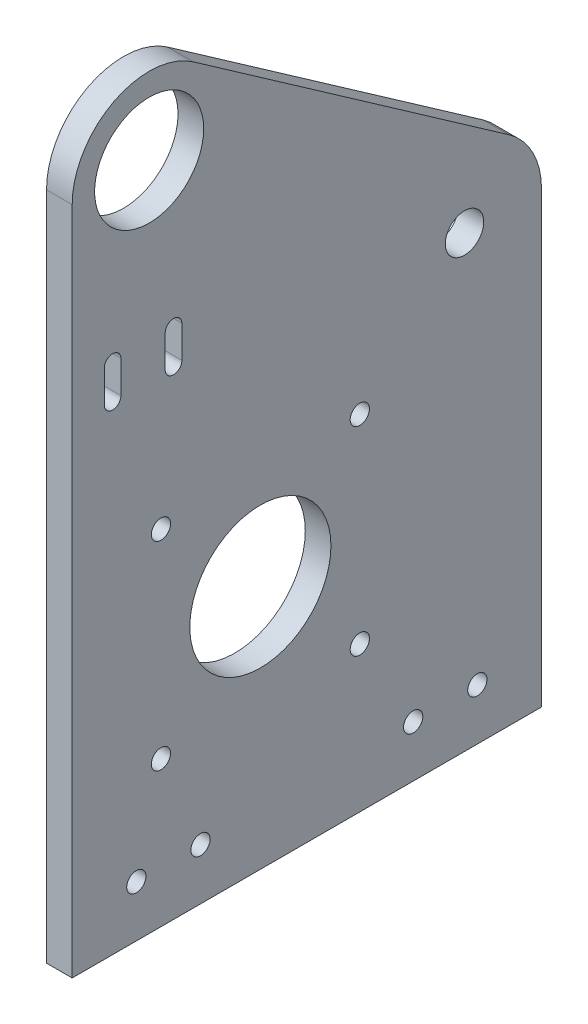
ISO-10303-21;
HEADER;
FILE_DESCRIPTION(('STEP AP214'),'2;1');
FILE_NAME('part.step','',(''),(''),'','','');
FILE_SCHEMA(('AUTOMOTIVE_DESIGN { 1 0 10303 214 1 1 1 1 }'));
ENDSEC;
DATA;
#1=APPLICATION_CONTEXT('core data for automotive mechanical design processes');
#2=APPLICATION_PROTOCOL_DEFINITION('international standard','automotive_design',2000,#1);
#3=PRODUCT_CONTEXT('',#1,'mechanical');
#4=PRODUCT('Part','Part','',(#3));
#5=PRODUCT_RELATED_PRODUCT_CATEGORY('part','',(#4));
#6=PRODUCT_DEFINITION_FORMATION('','',#4);
#7=PRODUCT_DEFINITION_CONTEXT('part definition',#1,'design');
#8=PRODUCT_DEFINITION('design','',#6,#7);
#9=PRODUCT_DEFINITION_SHAPE('','',#8);
#10=(LENGTH_UNIT() NAMED_UNIT(*) SI_UNIT(.MILLI.,.METRE.));
#11=(NAMED_UNIT(*) PLANE_ANGLE_UNIT() SI_UNIT($,.RADIAN.));
#12=(NAMED_UNIT(*) SI_UNIT($,.STERADIAN.) SOLID_ANGLE_UNIT());
#13=UNCERTAINTY_MEASURE_WITH_UNIT(LENGTH_MEASURE(1.E-05),#10,'distance_accuracy_value','');
#14=(GEOMETRIC_REPRESENTATION_CONTEXT(3) GLOBAL_UNCERTAINTY_ASSIGNED_CONTEXT((#13)) GLOBAL_UNIT_ASSIGNED_CONTEXT((#10,
#11,#12)) REPRESENTATION_CONTEXT('',''));
#15=CARTESIAN_POINT('',(0.,0.,0.));
#16=DIRECTION('',(0.,0.,1.));
#17=DIRECTION('',(1.,0.,0.));
#18=AXIS2_PLACEMENT_3D('',#15,#16,#17);
#19=CARTESIAN_POINT('',(4.,0.,44.0551336484807));
#20=DIRECTION('',(0.,0.,-1.));
#21=DIRECTION('',(-1.,0.,0.));
#22=AXIS2_PLACEMENT_3D('',#19,#20,#21);
#23=PLANE('',#22);
#24=DIRECTION('',(0.,-1.,0.));
#25=VECTOR('',#24,1.);
#26=CARTESIAN_POINT('',(0.,0.,44.0551336484807));
#27=LINE('',#26,#25);
#28=CARTESIAN_POINT('',(0.,9.83102672969614,44.0551336484807));
#29=VERTEX_POINT('',#28);
#30=CARTESIAN_POINT('',(0.,4.83102672969614,44.0551336484807));
#31=VERTEX_POINT('',#30);
#32=EDGE_CURVE('E228',#29,#31,#27,.T.);
#33=ORIENTED_EDGE('',*,*,#32,.T.);
#34=DIRECTION('',(-1.,0.,0.));
#35=VECTOR('',#34,1.);
#36=CARTESIAN_POINT('',(4.,4.83102672969614,44.0551336484807));
#37=LINE('',#36,#35);
#38=CARTESIAN_POINT('',(4.,4.83102672969614,44.0551336484807));
#39=VERTEX_POINT('',#38);
#40=EDGE_CURVE('E11',#39,#31,#37,.T.);
#41=ORIENTED_EDGE('',*,*,#40,.F.);
#42=DIRECTION('',(0.,-1.,0.));
#43=VECTOR('',#42,1.);
#44=CARTESIAN_POINT('',(4.,0.,44.0551336484807));
#45=LINE('',#44,#43);
#46=CARTESIAN_POINT('',(4.,9.83102672969614,44.0551336484807));
#47=VERTEX_POINT('',#46);
#48=EDGE_CURVE('E154',#47,#39,#45,.T.);
#49=ORIENTED_EDGE('',*,*,#48,.F.);
#50=DIRECTION('',(-1.,0.,0.));
#51=VECTOR('',#50,1.);
#52=CARTESIAN_POINT('',(4.,9.83102672969614,44.0551336484807));
#53=LINE('',#52,#51);
#54=EDGE_CURVE('E235',#47,#29,#53,.T.);
#55=ORIENTED_EDGE('',*,*,#54,.T.);
#56=EDGE_LOOP('',(#33,#41,#49,#55));
#57=FACE_BOUND('',#56,.T.);
#58=ADVANCED_FACE('F37',(#57),#23,.F.);
#59=CARTESIAN_POINT('',(4.,4.83102672969614,45.3551336484807));
#60=DIRECTION('',(-1.,0.,0.));
#61=DIRECTION('',(0.,0.,1.));
#62=AXIS2_PLACEMENT_3D('',#59,#60,#61);
#63=CYLINDRICAL_SURFACE('',#62,1.3);
#64=CARTESIAN_POINT('',(0.,4.83102672969614,45.3551336484807));
#65=DIRECTION('',(1.,0.,0.));
#66=DIRECTION('',(0.,0.,-1.));
#67=AXIS2_PLACEMENT_3D('',#64,#65,#66);
#68=CIRCLE('',#67,1.3);
#69=CARTESIAN_POINT('',(0.,4.83102672969614,46.6551336484807));
#70=VERTEX_POINT('',#69);
#71=EDGE_CURVE('E159',#31,#70,#68,.F.);
#72=ORIENTED_EDGE('',*,*,#71,.T.);
#73=DIRECTION('',(-1.,0.,0.));
#74=VECTOR('',#73,1.);
#75=CARTESIAN_POINT('',(4.,4.83102672969614,46.6551336484807));
#76=LINE('',#75,#74);
#77=CARTESIAN_POINT('',(4.,4.83102672969614,46.6551336484807));
#78=VERTEX_POINT('',#77);
#79=EDGE_CURVE('E47',#78,#70,#76,.T.);
#80=ORIENTED_EDGE('',*,*,#79,.F.);
#81=CARTESIAN_POINT('',(4.,4.83102672969614,45.3551336484807));
#82=DIRECTION('',(1.,0.,0.));
#83=DIRECTION('',(0.,0.,-1.));
#84=AXIS2_PLACEMENT_3D('',#81,#82,#83);
#85=CIRCLE('',#84,1.3);
#86=EDGE_CURVE('E148',#39,#78,#85,.F.);
#87=ORIENTED_EDGE('',*,*,#86,.F.);
#88=ORIENTED_EDGE('',*,*,#40,.T.);
#89=EDGE_LOOP('',(#72,#80,#87,#88));
#90=FACE_BOUND('',#89,.T.);
#91=ADVANCED_FACE('F158',(#90),#63,.F.);
#92=CARTESIAN_POINT('',(4.,0.,46.6551336484807));
#93=DIRECTION('',(0.,0.,1.));
#94=DIRECTION('',(0.,-1.,0.));
#95=AXIS2_PLACEMENT_3D('',#92,#93,#94);
#96=PLANE('',#95);
#97=DIRECTION('',(0.,1.,0.));
#98=VECTOR('',#97,1.);
#99=CARTESIAN_POINT('',(0.,0.,46.6551336484807));
#100=LINE('',#99,#98);
#101=CARTESIAN_POINT('',(0.,9.83102672969614,46.6551336484807));
#102=VERTEX_POINT('',#101);
#103=EDGE_CURVE('E103',#70,#102,#100,.T.);
#104=ORIENTED_EDGE('',*,*,#103,.T.);
#105=DIRECTION('',(-1.,0.,0.));
#106=VECTOR('',#105,1.);
#107=CARTESIAN_POINT('',(4.,9.83102672969614,46.6551336484807));
#108=LINE('',#107,#106);
#109=CARTESIAN_POINT('',(4.,9.83102672969614,46.6551336484807));
#110=VERTEX_POINT('',#109);
#111=EDGE_CURVE('E160',#110,#102,#108,.T.);
#112=ORIENTED_EDGE('',*,*,#111,.F.);
#113=DIRECTION('',(0.,1.,0.));
#114=VECTOR('',#113,1.);
#115=CARTESIAN_POINT('',(4.,0.,46.6551336484807));
#116=LINE('',#115,#114);
#117=EDGE_CURVE('E152',#78,#110,#116,.T.);
#118=ORIENTED_EDGE('',*,*,#117,.F.);
#119=ORIENTED_EDGE('',*,*,#79,.T.);
#120=EDGE_LOOP('',(#104,#112,#118,#119));
#121=FACE_BOUND('',#120,.T.);
#122=ADVANCED_FACE('F162',(#121),#96,.F.);
#123=CARTESIAN_POINT('',(4.,0.,53.5551336484807));
#124=DIRECTION('',(0.,0.,-1.));
#125=DIRECTION('',(-1.,0.,0.));
#126=AXIS2_PLACEMENT_3D('',#123,#124,#125);
#127=PLANE('',#126);
#128=DIRECTION('',(0.,-1.,0.));
#129=VECTOR('',#128,1.);
#130=CARTESIAN_POINT('',(0.,0.,53.5551336484807));
#131=LINE('',#130,#129);
#132=CARTESIAN_POINT('',(0.,9.83102672969614,53.5551336484807));
#133=VERTEX_POINT('',#132);
#134=CARTESIAN_POINT('',(0.,4.83102672969614,53.5551336484807));
#135=VERTEX_POINT('',#134);
#136=EDGE_CURVE('E219',#133,#135,#131,.T.);
#137=ORIENTED_EDGE('',*,*,#136,.T.);
#138=DIRECTION('',(-1.,0.,0.));
#139=VECTOR('',#138,1.);
#140=CARTESIAN_POINT('',(4.,4.83102672969614,53.5551336484807));
#141=LINE('',#140,#139);
#142=CARTESIAN_POINT('',(4.,4.83102672969614,53.5551336484807));
#143=VERTEX_POINT('',#142);
#144=EDGE_CURVE('E237',#143,#135,#141,.T.);
#145=ORIENTED_EDGE('',*,*,#144,.F.);
#146=DIRECTION('',(0.,-1.,0.));
#147=VECTOR('',#146,1.);
#148=CARTESIAN_POINT('',(4.,0.,53.5551336484807));
#149=LINE('',#148,#147);
#150=CARTESIAN_POINT('',(4.,9.83102672969614,53.5551336484807));
#151=VERTEX_POINT('',#150);
#152=EDGE_CURVE('E301',#151,#143,#149,.T.);
#153=ORIENTED_EDGE('',*,*,#152,.F.);
#154=DIRECTION('',(-1.,0.,0.));
#155=VECTOR('',#154,1.);
#156=CARTESIAN_POINT('',(4.,9.83102672969614,53.5551336484807));
#157=LINE('',#156,#155);
#158=EDGE_CURVE('E239',#151,#133,#157,.T.);
#159=ORIENTED_EDGE('',*,*,#158,.T.);
#160=EDGE_LOOP('',(#137,#145,#153,#159));
#161=FACE_BOUND('',#160,.T.);
#162=ADVANCED_FACE('F321',(#161),#127,.F.);
#163=CARTESIAN_POINT('',(4.,4.83102672969614,54.8551336484807));
#164=DIRECTION('',(-1.,0.,0.));
#165=DIRECTION('',(0.,0.,1.));
#166=AXIS2_PLACEMENT_3D('',#163,#164,#165);
#167=CYLINDRICAL_SURFACE('',#166,1.3);
#168=CARTESIAN_POINT('',(0.,4.83102672969614,54.8551336484807));
#169=DIRECTION('',(1.,0.,0.));
#170=DIRECTION('',(0.,0.,-1.));
#171=AXIS2_PLACEMENT_3D('',#168,#169,#170);
#172=CIRCLE('',#171,1.3);
#173=CARTESIAN_POINT('',(0.,4.83102672969614,56.1551336484807));
#174=VERTEX_POINT('',#173);
#175=EDGE_CURVE('E222',#135,#174,#172,.F.);
#176=ORIENTED_EDGE('',*,*,#175,.T.);
#177=DIRECTION('',(-1.,0.,0.));
#178=VECTOR('',#177,1.);
#179=CARTESIAN_POINT('',(4.,4.83102672969614,56.1551336484807));
#180=LINE('',#179,#178);
#181=CARTESIAN_POINT('',(4.,4.83102672969614,56.1551336484807));
#182=VERTEX_POINT('',#181);
#183=EDGE_CURVE('E245',#182,#174,#180,.T.);
#184=ORIENTED_EDGE('',*,*,#183,.F.);
#185=CARTESIAN_POINT('',(4.,4.83102672969614,54.8551336484807));
#186=DIRECTION('',(1.,0.,0.));
#187=DIRECTION('',(0.,0.,-1.));
#188=AXIS2_PLACEMENT_3D('',#185,#186,#187);
#189=CIRCLE('',#188,1.3);
#190=EDGE_CURVE('E304',#143,#182,#189,.F.);
#191=ORIENTED_EDGE('',*,*,#190,.F.);
#192=ORIENTED_EDGE('',*,*,#144,.T.);
#193=EDGE_LOOP('',(#176,#184,#191,#192));
#194=FACE_BOUND('',#193,.T.);
#195=ADVANCED_FACE('F323',(#194),#167,.F.);
#196=CARTESIAN_POINT('',(4.,0.,56.1551336484807));
#197=DIRECTION('',(0.,0.,1.));
#198=DIRECTION('',(0.,-1.,0.));
#199=AXIS2_PLACEMENT_3D('',#196,#197,#198);
#200=PLANE('',#199);
#201=DIRECTION('',(0.,1.,0.));
#202=VECTOR('',#201,1.);
#203=CARTESIAN_POINT('',(0.,0.,56.1551336484807));
#204=LINE('',#203,#202);
#205=CARTESIAN_POINT('',(0.,9.83102672969614,56.1551336484807));
#206=VERTEX_POINT('',#205);
#207=EDGE_CURVE('E224',#174,#206,#204,.T.);
#208=ORIENTED_EDGE('',*,*,#207,.T.);
#209=DIRECTION('',(-1.,0.,0.));
#210=VECTOR('',#209,1.);
#211=CARTESIAN_POINT('',(4.,9.83102672969614,56.1551336484807));
#212=LINE('',#211,#210);
#213=CARTESIAN_POINT('',(4.,9.83102672969614,56.1551336484807));
#214=VERTEX_POINT('',#213);
#215=EDGE_CURVE('E242',#214,#206,#212,.T.);
#216=ORIENTED_EDGE('',*,*,#215,.F.);
#217=DIRECTION('',(0.,1.,0.));
#218=VECTOR('',#217,1.);
#219=CARTESIAN_POINT('',(4.,0.,56.1551336484807));
#220=LINE('',#219,#218);
#221=EDGE_CURVE('E306',#182,#214,#220,.T.);
#222=ORIENTED_EDGE('',*,*,#221,.F.);
#223=ORIENTED_EDGE('',*,*,#183,.T.);
#224=EDGE_LOOP('',(#208,#216,#222,#223));
#225=FACE_BOUND('',#224,.T.);
#226=ADVANCED_FACE('F327',(#225),#200,.F.);
#227=CARTESIAN_POINT('',(4.,0.,0.));
#228=DIRECTION('',(-1.,0.,0.));
#229=DIRECTION('',(0.,0.,1.));
#230=AXIS2_PLACEMENT_3D('',#227,#228,#229);
#231=CYLINDRICAL_SURFACE('',#230,12.);
#232=CARTESIAN_POINT('',(0.,0.,0.));
#233=DIRECTION('',(1.,0.,0.));
#234=DIRECTION('',(0.,0.,-1.));
#235=AXIS2_PLACEMENT_3D('',#232,#233,#234);
#236=CIRCLE('',#235,12.);
#237=CARTESIAN_POINT('',(0.,9.83102672969615,-6.8812));
#238=VERTEX_POINT('',#237);
#239=CARTESIAN_POINT('',(0.,0.,-12.));
#240=VERTEX_POINT('',#239);
#241=EDGE_CURVE('E195',#238,#240,#236,.F.);
#242=ORIENTED_EDGE('',*,*,#241,.F.);
#243=DIRECTION('',(-1.,0.,0.));
#244=VECTOR('',#243,1.);
#245=CARTESIAN_POINT('',(4.,9.83102672969615,-6.8812));
#246=LINE('',#245,#244);
#247=CARTESIAN_POINT('',(4.,9.83102672969615,-6.8812));
#248=VERTEX_POINT('',#247);
#249=EDGE_CURVE('E41',#248,#238,#246,.T.);
#250=ORIENTED_EDGE('',*,*,#249,.F.);
#251=CARTESIAN_POINT('',(4.,0.,0.));
#252=DIRECTION('',(1.,0.,0.));
#253=DIRECTION('',(0.,0.,-1.));
#254=AXIS2_PLACEMENT_3D('',#251,#252,#253);
#255=CIRCLE('',#254,12.);
#256=CARTESIAN_POINT('',(4.,0.,-12.));
#257=VERTEX_POINT('',#256);
#258=EDGE_CURVE('E287',#248,#257,#255,.F.);
#259=ORIENTED_EDGE('',*,*,#258,.T.);
#260=DIRECTION('',(-1.,0.,0.));
#261=VECTOR('',#260,1.);
#262=CARTESIAN_POINT('',(4.,0.,-12.));
#263=LINE('',#262,#261);
#264=EDGE_CURVE('E164',#257,#240,#263,.T.);
#265=ORIENTED_EDGE('',*,*,#264,.T.);
#266=EDGE_LOOP('',(#242,#250,#259,#265));
#267=FACE_BOUND('',#266,.T.);
#268=ADVANCED_FACE('F267',(#267),#231,.T.);
#269=CARTESIAN_POINT('',(4.,9.83102672969615,-6.8812));
#270=DIRECTION('',(0.,0.819252227474679,-0.573433333333333));
#271=DIRECTION('',(0.,0.573433333333333,0.819252227474679));
#272=AXIS2_PLACEMENT_3D('',#269,#270,#271);
#273=PLANE('',#272);
#274=DIRECTION('',(0.,-0.573433333333333,-0.819252227474679));
#275=VECTOR('',#274,1.);
#276=CARTESIAN_POINT('',(0.,9.83102672969615,-6.8812));
#277=LINE('',#276,#275);
#278=CARTESIAN_POINT('',(0.,44.2370267296961,42.2739336484807));
#279=VERTEX_POINT('',#278);
#280=EDGE_CURVE('E198',#279,#238,#277,.T.);
#281=ORIENTED_EDGE('',*,*,#280,.F.);
#282=DIRECTION('',(-1.,0.,0.));
#283=VECTOR('',#282,1.);
#284=CARTESIAN_POINT('',(4.,44.2370267296961,42.2739336484807));
#285=LINE('',#284,#283);
#286=CARTESIAN_POINT('',(4.,44.2370267296961,42.2739336484807));
#287=VERTEX_POINT('',#286);
#288=EDGE_CURVE('E257',#287,#279,#285,.T.);
#289=ORIENTED_EDGE('',*,*,#288,.F.);
#290=DIRECTION('',(0.,-0.573433333333333,-0.819252227474679));
#291=VECTOR('',#290,1.);
#292=CARTESIAN_POINT('',(4.,9.83102672969615,-6.8812));
#293=LINE('',#292,#291);
#294=EDGE_CURVE('E266',#287,#248,#293,.T.);
#295=ORIENTED_EDGE('',*,*,#294,.T.);
#296=ORIENTED_EDGE('',*,*,#249,.T.);
#297=EDGE_LOOP('',(#281,#289,#295,#296));
#298=FACE_BOUND('',#297,.T.);
#299=ADVANCED_FACE('F264',(#298),#273,.T.);
#300=CARTESIAN_POINT('',(4.,34.406,49.1551336484807));
#301=DIRECTION('',(-1.,0.,0.));
#302=DIRECTION('',(0.,0.,1.));
#303=AXIS2_PLACEMENT_3D('',#300,#301,#302);
#304=CYLINDRICAL_SURFACE('',#303,12.);
#305=CARTESIAN_POINT('',(0.,34.406,49.1551336484807));
#306=DIRECTION('',(1.,0.,0.));
#307=DIRECTION('',(0.,0.,-1.));
#308=AXIS2_PLACEMENT_3D('',#305,#306,#307);
#309=CIRCLE('',#308,12.);
#310=CARTESIAN_POINT('',(0.,34.406,61.1551336484807));
#311=VERTEX_POINT('',#310);
#312=EDGE_CURVE('E201',#311,#279,#309,.F.);
#313=ORIENTED_EDGE('',*,*,#312,.F.);
#314=DIRECTION('',(-1.,0.,0.));
#315=VECTOR('',#314,1.);
#316=CARTESIAN_POINT('',(4.,34.406,61.1551336484807));
#317=LINE('',#316,#315);
#318=CARTESIAN_POINT('',(4.,34.406,61.1551336484807));
#319=VERTEX_POINT('',#318);
#320=EDGE_CURVE('E256',#319,#311,#317,.T.);
#321=ORIENTED_EDGE('',*,*,#320,.F.);
#322=CARTESIAN_POINT('',(4.,34.406,49.1551336484807));
#323=DIRECTION('',(1.,0.,0.));
#324=DIRECTION('',(0.,0.,-1.));
#325=AXIS2_PLACEMENT_3D('',#322,#323,#324);
#326=CIRCLE('',#325,12.);
#327=EDGE_CURVE('E276',#319,#287,#326,.F.);
#328=ORIENTED_EDGE('',*,*,#327,.T.);
#329=ORIENTED_EDGE('',*,*,#288,.T.);
#330=EDGE_LOOP('',(#313,#321,#328,#329));
#331=FACE_BOUND('',#330,.T.);
#332=ADVANCED_FACE('F273',(#331),#304,.T.);
#333=CARTESIAN_POINT('',(4.,0.,61.1551336484807));
#334=DIRECTION('',(0.,0.,-1.));
#335=DIRECTION('',(0.,1.,0.));
#336=AXIS2_PLACEMENT_3D('',#333,#334,#335);
#337=PLANE('',#336);
#338=DIRECTION('',(0.,-1.,0.));
#339=VECTOR('',#338,1.);
#340=CARTESIAN_POINT('',(0.,0.,61.1551336484807));
#341=LINE('',#340,#339);
#342=CARTESIAN_POINT('',(0.,-70.,61.1551336484807));
#343=VERTEX_POINT('',#342);
#344=EDGE_CURVE('E204',#311,#343,#341,.T.);
#345=ORIENTED_EDGE('',*,*,#344,.T.);
#346=DIRECTION('',(-1.,0.,0.));
#347=VECTOR('',#346,1.);
#348=CARTESIAN_POINT('',(4.,-70.,61.1551336484807));
#349=LINE('',#348,#347);
#350=CARTESIAN_POINT('',(4.,-70.,61.1551336484807));
#351=VERTEX_POINT('',#350);
#352=EDGE_CURVE('E253',#351,#343,#349,.T.);
#353=ORIENTED_EDGE('',*,*,#352,.F.);
#354=DIRECTION('',(0.,-1.,0.));
#355=VECTOR('',#354,1.);
#356=CARTESIAN_POINT('',(4.,0.,61.1551336484807));
#357=LINE('',#356,#355);
#358=EDGE_CURVE('E280',#319,#351,#357,.T.);
#359=ORIENTED_EDGE('',*,*,#358,.F.);
#360=ORIENTED_EDGE('',*,*,#320,.T.);
#361=EDGE_LOOP('',(#345,#353,#359,#360));
#362=FACE_BOUND('',#361,.T.);
#363=ADVANCED_FACE('F281',(#362),#337,.F.);
#364=CARTESIAN_POINT('',(4.,-70.,0.));
#365=DIRECTION('',(0.,1.,0.));
#366=DIRECTION('',(0.,0.,1.));
#367=AXIS2_PLACEMENT_3D('',#364,#365,#366);
#368=PLANE('',#367);
#369=DIRECTION('',(0.,0.,-1.));
#370=VECTOR('',#369,1.);
#371=CARTESIAN_POINT('',(0.,-70.,0.));
#372=LINE('',#371,#370);
#373=CARTESIAN_POINT('',(0.,-70.,-12.));
#374=VERTEX_POINT('',#373);
#375=EDGE_CURVE('E207',#343,#374,#372,.T.);
#376=ORIENTED_EDGE('',*,*,#375,.T.);
#377=DIRECTION('',(-1.,0.,0.));
#378=VECTOR('',#377,1.);
#379=CARTESIAN_POINT('',(4.,-70.,-12.));
#380=LINE('',#379,#378);
#381=CARTESIAN_POINT('',(4.,-70.,-12.));
#382=VERTEX_POINT('',#381);
#383=EDGE_CURVE('E251',#382,#374,#380,.T.);
#384=ORIENTED_EDGE('',*,*,#383,.F.);
#385=DIRECTION('',(0.,0.,-1.));
#386=VECTOR('',#385,1.);
#387=CARTESIAN_POINT('',(4.,-70.,0.));
#388=LINE('',#387,#386);
#389=EDGE_CURVE('E283',#351,#382,#388,.T.);
#390=ORIENTED_EDGE('',*,*,#389,.F.);
#391=ORIENTED_EDGE('',*,*,#352,.T.);
#392=EDGE_LOOP('',(#376,#384,#390,#391));
#393=FACE_BOUND('',#392,.T.);
#394=ADVANCED_FACE('F357',(#393),#368,.F.);
#395=CARTESIAN_POINT('',(4.,9.83102672969614,54.8551336484807));
#396=DIRECTION('',(-1.,0.,0.));
#397=DIRECTION('',(0.,0.,1.));
#398=AXIS2_PLACEMENT_3D('',#395,#396,#397);
#399=CYLINDRICAL_SURFACE('',#398,1.3);
#400=CARTESIAN_POINT('',(0.,9.83102672969614,54.8551336484807));
#401=DIRECTION('',(1.,0.,0.));
#402=DIRECTION('',(0.,0.,-1.));
#403=AXIS2_PLACEMENT_3D('',#400,#401,#402);
#404=CIRCLE('',#403,1.3);
#405=EDGE_CURVE('E226',#206,#133,#404,.F.);
#406=ORIENTED_EDGE('',*,*,#405,.T.);
#407=ORIENTED_EDGE('',*,*,#158,.F.);
#408=CARTESIAN_POINT('',(4.,9.83102672969614,54.8551336484807));
#409=DIRECTION('',(1.,0.,0.));
#410=DIRECTION('',(0.,0.,-1.));
#411=AXIS2_PLACEMENT_3D('',#408,#409,#410);
#412=CIRCLE('',#411,1.3);
#413=EDGE_CURVE('E308',#214,#151,#412,.F.);
#414=ORIENTED_EDGE('',*,*,#413,.F.);
#415=ORIENTED_EDGE('',*,*,#215,.T.);
#416=EDGE_LOOP('',(#406,#407,#414,#415));
#417=FACE_BOUND('',#416,.T.);
#418=ADVANCED_FACE('F317',(#417),#399,.F.);
#419=CARTESIAN_POINT('',(4.,0.,0.));
#420=DIRECTION('',(-1.,0.,0.));
#421=DIRECTION('',(0.,0.,1.));
#422=AXIS2_PLACEMENT_3D('',#419,#420,#421);
#423=CYLINDRICAL_SURFACE('',#422,3.);
#424=CARTESIAN_POINT('',(4.,0.,0.));
#425=DIRECTION('',(1.,0.,0.));
#426=DIRECTION('',(0.,0.,-1.));
#427=AXIS2_PLACEMENT_3D('',#424,#425,#426);
#428=CIRCLE('',#427,3.);
#429=CARTESIAN_POINT('',(4.,0.,-3.));
#430=VERTEX_POINT('',#429);
#431=EDGE_CURVE('E298',#430,#430,#428,.T.);
#432=ORIENTED_EDGE('',*,*,#431,.T.);
#433=EDGE_LOOP('',(#432));
#434=FACE_BOUND('',#433,.T.);
#435=CARTESIAN_POINT('',(0.,0.,0.));
#436=DIRECTION('',(1.,0.,0.));
#437=DIRECTION('',(0.,0.,-1.));
#438=AXIS2_PLACEMENT_3D('',#435,#436,#437);
#439=CIRCLE('',#438,3.);
#440=CARTESIAN_POINT('',(0.,0.,-3.));
#441=VERTEX_POINT('',#440);
#442=EDGE_CURVE('E216',#441,#441,#439,.T.);
#443=ORIENTED_EDGE('',*,*,#442,.F.);
#444=EDGE_LOOP('',(#443));
#445=FACE_BOUND('',#444,.T.);
#446=ADVANCED_FACE('F356',(#434,#445),#423,.F.);
#447=CARTESIAN_POINT('',(4.,34.406,49.1551336484807));
#448=DIRECTION('',(-1.,0.,0.));
#449=DIRECTION('',(0.,0.,1.));
#450=AXIS2_PLACEMENT_3D('',#447,#448,#449);
#451=CYLINDRICAL_SURFACE('',#450,8.5);
#452=CARTESIAN_POINT('',(4.,34.406,49.1551336484807));
#453=DIRECTION('',(1.,0.,0.));
#454=DIRECTION('',(0.,0.,-1.));
#455=AXIS2_PLACEMENT_3D('',#452,#453,#454);
#456=CIRCLE('',#455,8.5);
#457=CARTESIAN_POINT('',(4.,34.406,40.6551336484807));
#458=VERTEX_POINT('',#457);
#459=EDGE_CURVE('E295',#458,#458,#456,.T.);
#460=ORIENTED_EDGE('',*,*,#459,.T.);
#461=EDGE_LOOP('',(#460));
#462=FACE_BOUND('',#461,.T.);
#463=CARTESIAN_POINT('',(0.,34.406,49.1551336484807));
#464=DIRECTION('',(1.,0.,0.));
#465=DIRECTION('',(0.,0.,-1.));
#466=AXIS2_PLACEMENT_3D('',#463,#464,#465);
#467=CIRCLE('',#466,8.5);
#468=CARTESIAN_POINT('',(0.,34.406,40.6551336484807));
#469=VERTEX_POINT('',#468);
#470=EDGE_CURVE('E213',#469,#469,#467,.T.);
#471=ORIENTED_EDGE('',*,*,#470,.F.);
#472=EDGE_LOOP('',(#471));
#473=FACE_BOUND('',#472,.T.);
#474=ADVANCED_FACE('F366',(#462,#473),#451,.F.);
#475=CARTESIAN_POINT('',(4.,0.,-12.));
#476=DIRECTION('',(0.,0.,-1.));
#477=DIRECTION('',(0.,1.,0.));
#478=AXIS2_PLACEMENT_3D('',#475,#476,#477);
#479=PLANE('',#478);
#480=DIRECTION('',(0.,-1.,0.));
#481=VECTOR('',#480,1.);
#482=CARTESIAN_POINT('',(0.,0.,-12.));
#483=LINE('',#482,#481);
#484=EDGE_CURVE('E210',#240,#374,#483,.T.);
#485=ORIENTED_EDGE('',*,*,#484,.F.);
#486=ORIENTED_EDGE('',*,*,#264,.F.);
#487=DIRECTION('',(0.,-1.,0.));
#488=VECTOR('',#487,1.);
#489=CARTESIAN_POINT('',(4.,0.,-12.));
#490=LINE('',#489,#488);
#491=EDGE_CURVE('E292',#257,#382,#490,.T.);
#492=ORIENTED_EDGE('',*,*,#491,.T.);
#493=ORIENTED_EDGE('',*,*,#383,.T.);
#494=EDGE_LOOP('',(#485,#486,#492,#493));
#495=FACE_BOUND('',#494,.T.);
#496=ADVANCED_FACE('F370',(#495),#479,.T.);
#497=CARTESIAN_POINT('',(4.,-31.8198051533946,31.8198051533946));
#498=DIRECTION('',(-1.,0.,0.));
#499=DIRECTION('',(0.,0.,1.));
#500=AXIS2_PLACEMENT_3D('',#497,#498,#499);
#501=CYLINDRICAL_SURFACE('',#500,11.);
#502=CARTESIAN_POINT('',(4.,-31.8198051533946,31.8198051533946));
#503=DIRECTION('',(1.,0.,0.));
#504=DIRECTION('',(0.,0.,-1.));
#505=AXIS2_PLACEMENT_3D('',#502,#503,#504);
#506=CIRCLE('',#505,11.);
#507=CARTESIAN_POINT('',(4.,-31.8198051533946,20.8198051533946));
#508=VERTEX_POINT('',#507);
#509=EDGE_CURVE('E467',#508,#508,#506,.T.);
#510=ORIENTED_EDGE('',*,*,#509,.T.);
#511=EDGE_LOOP('',(#510));
#512=FACE_BOUND('',#511,.T.);
#513=CARTESIAN_POINT('',(0.,-31.8198051533946,31.8198051533946));
#514=DIRECTION('',(1.,0.,0.));
#515=DIRECTION('',(0.,0.,-1.));
#516=AXIS2_PLACEMENT_3D('',#513,#514,#515);
#517=CIRCLE('',#516,11.);
#518=CARTESIAN_POINT('',(0.,-31.8198051533946,20.8198051533946));
#519=VERTEX_POINT('',#518);
#520=EDGE_CURVE('E192',#519,#519,#517,.T.);
#521=ORIENTED_EDGE('',*,*,#520,.F.);
#522=EDGE_LOOP('',(#521));
#523=FACE_BOUND('',#522,.T.);
#524=ADVANCED_FACE('F374',(#512,#523),#501,.F.);
#525=CARTESIAN_POINT('',(4.,-62.,-2.00000000000001));
#526=DIRECTION('',(-1.,0.,0.));
#527=DIRECTION('',(0.,0.,1.));
#528=AXIS2_PLACEMENT_3D('',#525,#526,#527);
#529=CYLINDRICAL_SURFACE('',#528,1.5);
#530=CARTESIAN_POINT('',(4.,-62.,-2.00000000000001));
#531=DIRECTION('',(1.,0.,0.));
#532=DIRECTION('',(0.,0.,-1.));
#533=AXIS2_PLACEMENT_3D('',#530,#531,#532);
#534=CIRCLE('',#533,1.5);
#535=CARTESIAN_POINT('',(4.,-62.,-3.50000000000001));
#536=VERTEX_POINT('',#535);
#537=EDGE_CURVE('E464',#536,#536,#534,.T.);
#538=ORIENTED_EDGE('',*,*,#537,.T.);
#539=EDGE_LOOP('',(#538));
#540=FACE_BOUND('',#539,.T.);
#541=CARTESIAN_POINT('',(0.,-62.,-2.00000000000001));
#542=DIRECTION('',(1.,0.,0.));
#543=DIRECTION('',(0.,0.,-1.));
#544=AXIS2_PLACEMENT_3D('',#541,#542,#543);
#545=CIRCLE('',#544,1.5);
#546=CARTESIAN_POINT('',(0.,-62.,-3.50000000000001));
#547=VERTEX_POINT('',#546);
#548=EDGE_CURVE('E189',#547,#547,#545,.T.);
#549=ORIENTED_EDGE('',*,*,#548,.F.);
#550=EDGE_LOOP('',(#549));
#551=FACE_BOUND('',#550,.T.);
#552=ADVANCED_FACE('F389',(#540,#551),#529,.F.);
#553=CARTESIAN_POINT('',(4.,-62.,7.99999999999999));
#554=DIRECTION('',(-1.,0.,0.));
#555=DIRECTION('',(0.,0.,1.));
#556=AXIS2_PLACEMENT_3D('',#553,#554,#555);
#557=CYLINDRICAL_SURFACE('',#556,1.5);
#558=CARTESIAN_POINT('',(4.,-62.,7.99999999999999));
#559=DIRECTION('',(1.,0.,0.));
#560=DIRECTION('',(0.,0.,-1.));
#561=AXIS2_PLACEMENT_3D('',#558,#559,#560);
#562=CIRCLE('',#561,1.5);
#563=CARTESIAN_POINT('',(4.,-62.,6.49999999999999));
#564=VERTEX_POINT('',#563);
#565=EDGE_CURVE('E461',#564,#564,#562,.T.);
#566=ORIENTED_EDGE('',*,*,#565,.T.);
#567=EDGE_LOOP('',(#566));
#568=FACE_BOUND('',#567,.T.);
#569=CARTESIAN_POINT('',(0.,-62.,7.99999999999999));
#570=DIRECTION('',(1.,0.,0.));
#571=DIRECTION('',(0.,0.,-1.));
#572=AXIS2_PLACEMENT_3D('',#569,#570,#571);
#573=CIRCLE('',#572,1.5);
#574=CARTESIAN_POINT('',(0.,-62.,6.49999999999999));
#575=VERTEX_POINT('',#574);
#576=EDGE_CURVE('E186',#575,#575,#573,.T.);
#577=ORIENTED_EDGE('',*,*,#576,.F.);
#578=EDGE_LOOP('',(#577));
#579=FACE_BOUND('',#578,.T.);
#580=ADVANCED_FACE('F393',(#568,#579),#557,.F.);
#581=CARTESIAN_POINT('',(4.,-62.,41.1551336484807));
#582=DIRECTION('',(-1.,0.,0.));
#583=DIRECTION('',(0.,0.,1.));
#584=AXIS2_PLACEMENT_3D('',#581,#582,#583);
#585=CYLINDRICAL_SURFACE('',#584,1.5);
#586=CARTESIAN_POINT('',(4.,-62.,41.1551336484807));
#587=DIRECTION('',(1.,0.,0.));
#588=DIRECTION('',(0.,0.,-1.));
#589=AXIS2_PLACEMENT_3D('',#586,#587,#588);
#590=CIRCLE('',#589,1.5);
#591=CARTESIAN_POINT('',(4.,-62.,39.6551336484807));
#592=VERTEX_POINT('',#591);
#593=EDGE_CURVE('E458',#592,#592,#590,.T.);
#594=ORIENTED_EDGE('',*,*,#593,.T.);
#595=EDGE_LOOP('',(#594));
#596=FACE_BOUND('',#595,.T.);
#597=CARTESIAN_POINT('',(0.,-62.,41.1551336484807));
#598=DIRECTION('',(1.,0.,0.));
#599=DIRECTION('',(0.,0.,-1.));
#600=AXIS2_PLACEMENT_3D('',#597,#598,#599);
#601=CIRCLE('',#600,1.5);
#602=CARTESIAN_POINT('',(0.,-62.,39.6551336484807));
#603=VERTEX_POINT('',#602);
#604=EDGE_CURVE('E183',#603,#603,#601,.T.);
#605=ORIENTED_EDGE('',*,*,#604,.F.);
#606=EDGE_LOOP('',(#605));
#607=FACE_BOUND('',#606,.T.);
#608=ADVANCED_FACE('F397',(#596,#607),#585,.F.);
#609=CARTESIAN_POINT('',(4.,-62.,51.1551336484807));
#610=DIRECTION('',(-1.,0.,0.));
#611=DIRECTION('',(0.,0.,1.));
#612=AXIS2_PLACEMENT_3D('',#609,#610,#611);
#613=CYLINDRICAL_SURFACE('',#612,1.5);
#614=CARTESIAN_POINT('',(4.,-62.,51.1551336484807));
#615=DIRECTION('',(1.,0.,0.));
#616=DIRECTION('',(0.,0.,-1.));
#617=AXIS2_PLACEMENT_3D('',#614,#615,#616);
#618=CIRCLE('',#617,1.5);
#619=CARTESIAN_POINT('',(4.,-62.,49.6551336484807));
#620=VERTEX_POINT('',#619);
#621=EDGE_CURVE('E455',#620,#620,#618,.T.);
#622=ORIENTED_EDGE('',*,*,#621,.T.);
#623=EDGE_LOOP('',(#622));
#624=FACE_BOUND('',#623,.T.);
#625=CARTESIAN_POINT('',(0.,-62.,51.1551336484807));
#626=DIRECTION('',(1.,0.,0.));
#627=DIRECTION('',(0.,0.,-1.));
#628=AXIS2_PLACEMENT_3D('',#625,#626,#627);
#629=CIRCLE('',#628,1.5);
#630=CARTESIAN_POINT('',(0.,-62.,49.6551336484807));
#631=VERTEX_POINT('',#630);
#632=EDGE_CURVE('E180',#631,#631,#629,.T.);
#633=ORIENTED_EDGE('',*,*,#632,.F.);
#634=EDGE_LOOP('',(#633));
#635=FACE_BOUND('',#634,.T.);
#636=ADVANCED_FACE('F401',(#624,#635),#613,.F.);
#637=CARTESIAN_POINT('',(4.,-16.3198051533946,16.3198051533946));
#638=DIRECTION('',(-1.,0.,0.));
#639=DIRECTION('',(0.,0.,1.));
#640=AXIS2_PLACEMENT_3D('',#637,#638,#639);
#641=CYLINDRICAL_SURFACE('',#640,1.5);
#642=CARTESIAN_POINT('',(4.,-16.3198051533946,16.3198051533946));
#643=DIRECTION('',(1.,0.,0.));
#644=DIRECTION('',(0.,0.,-1.));
#645=AXIS2_PLACEMENT_3D('',#642,#643,#644);
#646=CIRCLE('',#645,1.5);
#647=CARTESIAN_POINT('',(4.,-16.3198051533946,14.8198051533946));
#648=VERTEX_POINT('',#647);
#649=EDGE_CURVE('E448',#648,#648,#646,.T.);
#650=ORIENTED_EDGE('',*,*,#649,.T.);
#651=EDGE_LOOP('',(#650));
#652=FACE_BOUND('',#651,.T.);
#653=CARTESIAN_POINT('',(0.,-16.3198051533946,16.3198051533946));
#654=DIRECTION('',(1.,0.,0.));
#655=DIRECTION('',(0.,0.,-1.));
#656=AXIS2_PLACEMENT_3D('',#653,#654,#655);
#657=CIRCLE('',#656,1.5);
#658=CARTESIAN_POINT('',(0.,-16.3198051533946,14.8198051533946));
#659=VERTEX_POINT('',#658);
#660=EDGE_CURVE('E177',#659,#659,#657,.T.);
#661=ORIENTED_EDGE('',*,*,#660,.F.);
#662=EDGE_LOOP('',(#661));
#663=FACE_BOUND('',#662,.T.);
#664=ADVANCED_FACE('F405',(#652,#663),#641,.F.);
#665=CARTESIAN_POINT('',(4.,-47.3198051466054,16.3198051533938));
#666=DIRECTION('',(-1.,0.,0.));
#667=DIRECTION('',(0.,0.,1.));
#668=AXIS2_PLACEMENT_3D('',#665,#666,#667);
#669=CYLINDRICAL_SURFACE('',#668,1.5);
#670=CARTESIAN_POINT('',(4.,-47.3198051466054,16.3198051533938));
#671=DIRECTION('',(1.,0.,0.));
#672=DIRECTION('',(0.,0.,-1.));
#673=AXIS2_PLACEMENT_3D('',#670,#671,#672);
#674=CIRCLE('',#673,1.5);
#675=CARTESIAN_POINT('',(4.,-47.3198051466054,14.8198051533938));
#676=VERTEX_POINT('',#675);
#677=EDGE_CURVE('E445',#676,#676,#674,.T.);
#678=ORIENTED_EDGE('',*,*,#677,.T.);
#679=EDGE_LOOP('',(#678));
#680=FACE_BOUND('',#679,.T.);
#681=CARTESIAN_POINT('',(0.,-47.3198051466054,16.3198051533938));
#682=DIRECTION('',(1.,0.,0.));
#683=DIRECTION('',(0.,0.,-1.));
#684=AXIS2_PLACEMENT_3D('',#681,#682,#683);
#685=CIRCLE('',#684,1.5);
#686=CARTESIAN_POINT('',(0.,-47.3198051466054,14.8198051533938));
#687=VERTEX_POINT('',#686);
#688=EDGE_CURVE('E174',#687,#687,#685,.T.);
#689=ORIENTED_EDGE('',*,*,#688,.F.);
#690=EDGE_LOOP('',(#689));
#691=FACE_BOUND('',#690,.T.);
#692=ADVANCED_FACE('F409',(#680,#691),#669,.F.);
#693=CARTESIAN_POINT('',(4.,-47.3198051466061,47.3198051466046));
#694=DIRECTION('',(-1.,0.,0.));
#695=DIRECTION('',(0.,0.,1.));
#696=AXIS2_PLACEMENT_3D('',#693,#694,#695);
#697=CYLINDRICAL_SURFACE('',#696,1.5);
#698=CARTESIAN_POINT('',(4.,-47.3198051466061,47.3198051466046));
#699=DIRECTION('',(1.,0.,0.));
#700=DIRECTION('',(0.,0.,-1.));
#701=AXIS2_PLACEMENT_3D('',#698,#699,#700);
#702=CIRCLE('',#701,1.5);
#703=CARTESIAN_POINT('',(4.,-47.3198051466061,45.8198051466046));
#704=VERTEX_POINT('',#703);
#705=EDGE_CURVE('E420',#704,#704,#702,.T.);
#706=ORIENTED_EDGE('',*,*,#705,.T.);
#707=EDGE_LOOP('',(#706));
#708=FACE_BOUND('',#707,.T.);
#709=CARTESIAN_POINT('',(0.,-47.3198051466061,47.3198051466046));
#710=DIRECTION('',(1.,0.,0.));
#711=DIRECTION('',(0.,0.,-1.));
#712=AXIS2_PLACEMENT_3D('',#709,#710,#711);
#713=CIRCLE('',#712,1.5);
#714=CARTESIAN_POINT('',(0.,-47.3198051466061,45.8198051466046));
#715=VERTEX_POINT('',#714);
#716=EDGE_CURVE('E171',#715,#715,#713,.T.);
#717=ORIENTED_EDGE('',*,*,#716,.F.);
#718=EDGE_LOOP('',(#717));
#719=FACE_BOUND('',#718,.T.);
#720=ADVANCED_FACE('F344',(#708,#719),#697,.F.);
#721=CARTESIAN_POINT('',(4.,-16.3198051533953,47.3198051466052));
#722=DIRECTION('',(-1.,0.,0.));
#723=DIRECTION('',(0.,0.,1.));
#724=AXIS2_PLACEMENT_3D('',#721,#722,#723);
#725=CYLINDRICAL_SURFACE('',#724,1.5);
#726=CARTESIAN_POINT('',(4.,-16.3198051533953,47.3198051466052));
#727=DIRECTION('',(1.,0.,0.));
#728=DIRECTION('',(0.,0.,-1.));
#729=AXIS2_PLACEMENT_3D('',#726,#727,#728);
#730=CIRCLE('',#729,1.5);
#731=CARTESIAN_POINT('',(4.,-16.3198051533953,45.8198051466052));
#732=VERTEX_POINT('',#731);
#733=EDGE_CURVE('E234',#732,#732,#730,.T.);
#734=ORIENTED_EDGE('',*,*,#733,.T.);
#735=EDGE_LOOP('',(#734));
#736=FACE_BOUND('',#735,.T.);
#737=CARTESIAN_POINT('',(0.,-16.3198051533953,47.3198051466052));
#738=DIRECTION('',(1.,0.,0.));
#739=DIRECTION('',(0.,0.,-1.));
#740=AXIS2_PLACEMENT_3D('',#737,#738,#739);
#741=CIRCLE('',#740,1.5);
#742=CARTESIAN_POINT('',(0.,-16.3198051533953,45.8198051466052));
#743=VERTEX_POINT('',#742);
#744=EDGE_CURVE('E168',#743,#743,#741,.T.);
#745=ORIENTED_EDGE('',*,*,#744,.F.);
#746=EDGE_LOOP('',(#745));
#747=FACE_BOUND('',#746,.T.);
#748=ADVANCED_FACE('F39',(#736,#747),#725,.F.);
#749=CARTESIAN_POINT('',(4.,9.83102672969614,45.3551336484807));
#750=DIRECTION('',(-1.,0.,0.));
#751=DIRECTION('',(0.,0.,1.));
#752=AXIS2_PLACEMENT_3D('',#749,#750,#751);
#753=CYLINDRICAL_SURFACE('',#752,1.3);
#754=CARTESIAN_POINT('',(0.,9.83102672969614,45.3551336484807));
#755=DIRECTION('',(1.,0.,0.));
#756=DIRECTION('',(0.,0.,-1.));
#757=AXIS2_PLACEMENT_3D('',#754,#755,#756);
#758=CIRCLE('',#757,1.3);
#759=EDGE_CURVE('E109',#102,#29,#758,.F.);
#760=ORIENTED_EDGE('',*,*,#759,.T.);
#761=ORIENTED_EDGE('',*,*,#54,.F.);
#762=CARTESIAN_POINT('',(4.,9.83102672969614,45.3551336484807));
#763=DIRECTION('',(1.,0.,0.));
#764=DIRECTION('',(0.,0.,-1.));
#765=AXIS2_PLACEMENT_3D('',#762,#763,#764);
#766=CIRCLE('',#765,1.3);
#767=EDGE_CURVE('E56',#110,#47,#766,.F.);
#768=ORIENTED_EDGE('',*,*,#767,.F.);
#769=ORIENTED_EDGE('',*,*,#111,.T.);
#770=EDGE_LOOP('',(#760,#761,#768,#769));
#771=FACE_BOUND('',#770,.T.);
#772=ADVANCED_FACE('F335',(#771),#753,.F.);
#773=CARTESIAN_POINT('',(4.,0.,0.));
#774=DIRECTION('',(1.,0.,0.));
#775=DIRECTION('',(0.,0.,-1.));
#776=AXIS2_PLACEMENT_3D('',#773,#774,#775);
#777=PLANE('',#776);
#778=ORIENTED_EDGE('',*,*,#733,.F.);
#779=EDGE_LOOP('',(#778));
#780=FACE_BOUND('',#779,.T.);
#781=ORIENTED_EDGE('',*,*,#705,.F.);
#782=EDGE_LOOP('',(#781));
#783=FACE_BOUND('',#782,.T.);
#784=ORIENTED_EDGE('',*,*,#677,.F.);
#785=EDGE_LOOP('',(#784));
#786=FACE_BOUND('',#785,.T.);
#787=ORIENTED_EDGE('',*,*,#649,.F.);
#788=EDGE_LOOP('',(#787));
#789=FACE_BOUND('',#788,.T.);
#790=ORIENTED_EDGE('',*,*,#621,.F.);
#791=EDGE_LOOP('',(#790));
#792=FACE_BOUND('',#791,.T.);
#793=ORIENTED_EDGE('',*,*,#593,.F.);
#794=EDGE_LOOP('',(#793));
#795=FACE_BOUND('',#794,.T.);
#796=ORIENTED_EDGE('',*,*,#565,.F.);
#797=EDGE_LOOP('',(#796));
#798=FACE_BOUND('',#797,.T.);
#799=ORIENTED_EDGE('',*,*,#537,.F.);
#800=EDGE_LOOP('',(#799));
#801=FACE_BOUND('',#800,.T.);
#802=ORIENTED_EDGE('',*,*,#509,.F.);
#803=EDGE_LOOP('',(#802));
#804=FACE_BOUND('',#803,.T.);
#805=ORIENTED_EDGE('',*,*,#258,.F.);
#806=ORIENTED_EDGE('',*,*,#294,.F.);
#807=ORIENTED_EDGE('',*,*,#327,.F.);
#808=ORIENTED_EDGE('',*,*,#358,.T.);
#809=ORIENTED_EDGE('',*,*,#389,.T.);
#810=ORIENTED_EDGE('',*,*,#491,.F.);
#811=EDGE_LOOP('',(#805,#806,#807,#808,#809,#810));
#812=FACE_BOUND('',#811,.T.);
#813=ORIENTED_EDGE('',*,*,#459,.F.);
#814=EDGE_LOOP('',(#813));
#815=FACE_BOUND('',#814,.T.);
#816=ORIENTED_EDGE('',*,*,#431,.F.);
#817=EDGE_LOOP('',(#816));
#818=FACE_BOUND('',#817,.T.);
#819=ORIENTED_EDGE('',*,*,#152,.T.);
#820=ORIENTED_EDGE('',*,*,#190,.T.);
#821=ORIENTED_EDGE('',*,*,#221,.T.);
#822=ORIENTED_EDGE('',*,*,#413,.T.);
#823=EDGE_LOOP('',(#819,#820,#821,#822));
#824=FACE_BOUND('',#823,.T.);
#825=ORIENTED_EDGE('',*,*,#48,.T.);
#826=ORIENTED_EDGE('',*,*,#86,.T.);
#827=ORIENTED_EDGE('',*,*,#117,.T.);
#828=ORIENTED_EDGE('',*,*,#767,.T.);
#829=EDGE_LOOP('',(#825,#826,#827,#828));
#830=FACE_BOUND('',#829,.T.);
#831=ADVANCED_FACE('F150',(#780,#783,#786,#789,#792,#795,#798,#801,#804,#812,#815,#818,#824,
#830),#777,.T.);
#832=CARTESIAN_POINT('',(0.,0.,0.));
#833=DIRECTION('',(1.,0.,0.));
#834=DIRECTION('',(0.,0.,-1.));
#835=AXIS2_PLACEMENT_3D('',#832,#833,#834);
#836=PLANE('',#835);
#837=ORIENTED_EDGE('',*,*,#744,.T.);
#838=EDGE_LOOP('',(#837));
#839=FACE_BOUND('',#838,.T.);
#840=ORIENTED_EDGE('',*,*,#716,.T.);
#841=EDGE_LOOP('',(#840));
#842=FACE_BOUND('',#841,.T.);
#843=ORIENTED_EDGE('',*,*,#688,.T.);
#844=EDGE_LOOP('',(#843));
#845=FACE_BOUND('',#844,.T.);
#846=ORIENTED_EDGE('',*,*,#660,.T.);
#847=EDGE_LOOP('',(#846));
#848=FACE_BOUND('',#847,.T.);
#849=ORIENTED_EDGE('',*,*,#632,.T.);
#850=EDGE_LOOP('',(#849));
#851=FACE_BOUND('',#850,.T.);
#852=ORIENTED_EDGE('',*,*,#604,.T.);
#853=EDGE_LOOP('',(#852));
#854=FACE_BOUND('',#853,.T.);
#855=ORIENTED_EDGE('',*,*,#576,.T.);
#856=EDGE_LOOP('',(#855));
#857=FACE_BOUND('',#856,.T.);
#858=ORIENTED_EDGE('',*,*,#548,.T.);
#859=EDGE_LOOP('',(#858));
#860=FACE_BOUND('',#859,.T.);
#861=ORIENTED_EDGE('',*,*,#520,.T.);
#862=EDGE_LOOP('',(#861));
#863=FACE_BOUND('',#862,.T.);
#864=ORIENTED_EDGE('',*,*,#241,.T.);
#865=ORIENTED_EDGE('',*,*,#484,.T.);
#866=ORIENTED_EDGE('',*,*,#375,.F.);
#867=ORIENTED_EDGE('',*,*,#344,.F.);
#868=ORIENTED_EDGE('',*,*,#312,.T.);
#869=ORIENTED_EDGE('',*,*,#280,.T.);
#870=EDGE_LOOP('',(#864,#865,#866,#867,#868,#869));
#871=FACE_BOUND('',#870,.T.);
#872=ORIENTED_EDGE('',*,*,#470,.T.);
#873=EDGE_LOOP('',(#872));
#874=FACE_BOUND('',#873,.T.);
#875=ORIENTED_EDGE('',*,*,#442,.T.);
#876=EDGE_LOOP('',(#875));
#877=FACE_BOUND('',#876,.T.);
#878=ORIENTED_EDGE('',*,*,#136,.F.);
#879=ORIENTED_EDGE('',*,*,#405,.F.);
#880=ORIENTED_EDGE('',*,*,#207,.F.);
#881=ORIENTED_EDGE('',*,*,#175,.F.);
#882=EDGE_LOOP('',(#878,#879,#880,#881));
#883=FACE_BOUND('',#882,.T.);
#884=ORIENTED_EDGE('',*,*,#32,.F.);
#885=ORIENTED_EDGE('',*,*,#759,.F.);
#886=ORIENTED_EDGE('',*,*,#103,.F.);
#887=ORIENTED_EDGE('',*,*,#71,.F.);
#888=EDGE_LOOP('',(#884,#885,#886,#887));
#889=FACE_BOUND('',#888,.T.);
#890=ADVANCED_FACE('F270',(#839,#842,#845,#848,#851,#854,#857,#860,#863,#871,#874,#877,#883,
#889),#836,.F.);
#891=CLOSED_SHELL('',(#58,#91,#122,#162,#195,#226,#268,#299,#332,#363,#394,#418,#446,#474,#496,
#524,#552,#580,#608,#636,#664,#692,#720,#748,#772,#831,#890));
#892=MANIFOLD_SOLID_BREP('B2',#891);
#893=ADVANCED_BREP_SHAPE_REPRESENTATION('',(#18,#892),#14);
#894=SHAPE_DEFINITION_REPRESENTATION(#9,#893);
ENDSEC;
END-ISO-10303-21;
